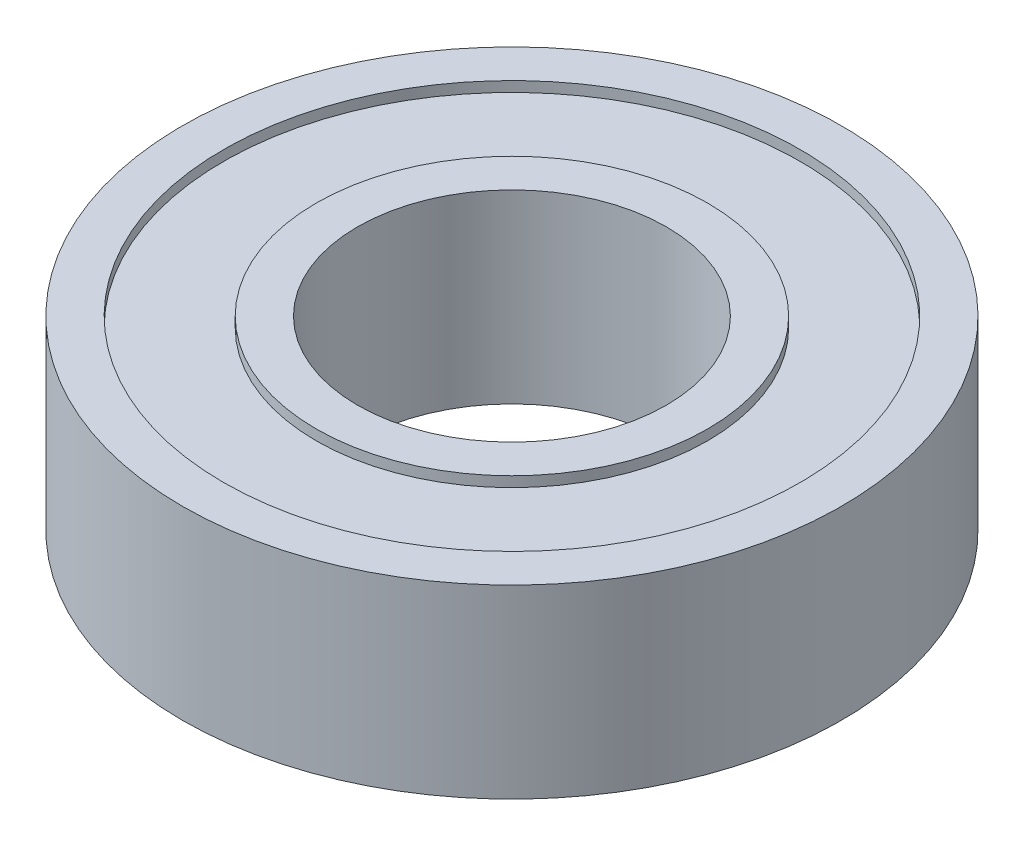
ISO-10303-21;
HEADER;
FILE_DESCRIPTION(('STEP AP214'),'2;1');
FILE_NAME('part.step','',(''),(''),'','','');
FILE_SCHEMA(('AUTOMOTIVE_DESIGN { 1 0 10303 214 1 1 1 1 }'));
ENDSEC;
DATA;
#1=APPLICATION_CONTEXT('core data for automotive mechanical design processes');
#2=APPLICATION_PROTOCOL_DEFINITION('international standard','automotive_design',2000,#1);
#3=PRODUCT_CONTEXT('',#1,'mechanical');
#4=PRODUCT('Part','Part','',(#3));
#5=PRODUCT_RELATED_PRODUCT_CATEGORY('part','',(#4));
#6=PRODUCT_DEFINITION_FORMATION('','',#4);
#7=PRODUCT_DEFINITION_CONTEXT('part definition',#1,'design');
#8=PRODUCT_DEFINITION('design','',#6,#7);
#9=PRODUCT_DEFINITION_SHAPE('','',#8);
#10=(LENGTH_UNIT() NAMED_UNIT(*) SI_UNIT(.MILLI.,.METRE.));
#11=(NAMED_UNIT(*) PLANE_ANGLE_UNIT() SI_UNIT($,.RADIAN.));
#12=(NAMED_UNIT(*) SI_UNIT($,.STERADIAN.) SOLID_ANGLE_UNIT());
#13=UNCERTAINTY_MEASURE_WITH_UNIT(LENGTH_MEASURE(1.E-05),#10,'distance_accuracy_value','');
#14=(GEOMETRIC_REPRESENTATION_CONTEXT(3) GLOBAL_UNCERTAINTY_ASSIGNED_CONTEXT((#13)) GLOBAL_UNIT_ASSIGNED_CONTEXT((#10,
#11,#12)) REPRESENTATION_CONTEXT('',''));
#15=CARTESIAN_POINT('',(0.,0.,0.));
#16=DIRECTION('',(0.,0.,1.));
#17=DIRECTION('',(1.,0.,0.));
#18=AXIS2_PLACEMENT_3D('',#15,#16,#17);
#19=CARTESIAN_POINT('',(0.,23.5028282345443,0.));
#20=DIRECTION('',(0.,1.,0.));
#21=DIRECTION('',(0.,0.,1.));
#22=AXIS2_PLACEMENT_3D('',#19,#20,#21);
#23=CYLINDRICAL_SURFACE('',#22,9.5);
#24=CARTESIAN_POINT('',(0.,4.,0.));
#25=DIRECTION('',(0.,1.,0.));
#26=DIRECTION('',(0.,0.,1.));
#27=AXIS2_PLACEMENT_3D('',#24,#25,#26);
#28=CIRCLE('',#27,9.5);
#29=CARTESIAN_POINT('',(0.,4.,9.5));
#30=VERTEX_POINT('',#29);
#31=EDGE_CURVE('E52',#30,#30,#28,.T.);
#32=ORIENTED_EDGE('',*,*,#31,.T.);
#33=EDGE_LOOP('',(#32));
#34=FACE_BOUND('',#33,.T.);
#35=CARTESIAN_POINT('',(0.,4.5,0.));
#36=DIRECTION('',(0.,1.,0.));
#37=DIRECTION('',(0.,0.,1.));
#38=AXIS2_PLACEMENT_3D('',#35,#36,#37);
#39=CIRCLE('',#38,9.5);
#40=CARTESIAN_POINT('',(0.,4.5,9.5));
#41=VERTEX_POINT('',#40);
#42=EDGE_CURVE('E39',#41,#41,#39,.T.);
#43=ORIENTED_EDGE('',*,*,#42,.F.);
#44=EDGE_LOOP('',(#43));
#45=FACE_BOUND('',#44,.T.);
#46=ADVANCED_FACE('F32',(#34,#45),#23,.T.);
#47=CARTESIAN_POINT('',(0.,23.5028282345443,0.));
#48=DIRECTION('',(0.,1.,0.));
#49=DIRECTION('',(0.,0.,1.));
#50=AXIS2_PLACEMENT_3D('',#47,#48,#49);
#51=CYLINDRICAL_SURFACE('',#50,7.5);
#52=CARTESIAN_POINT('',(0.,-4.5,0.));
#53=DIRECTION('',(0.,1.,0.));
#54=DIRECTION('',(0.,0.,1.));
#55=AXIS2_PLACEMENT_3D('',#52,#53,#54);
#56=CIRCLE('',#55,7.5);
#57=CARTESIAN_POINT('',(0.,-4.5,7.5));
#58=VERTEX_POINT('',#57);
#59=EDGE_CURVE('E47',#58,#58,#56,.T.);
#60=ORIENTED_EDGE('',*,*,#59,.F.);
#61=EDGE_LOOP('',(#60));
#62=FACE_BOUND('',#61,.T.);
#63=CARTESIAN_POINT('',(0.,4.5,0.));
#64=DIRECTION('',(0.,1.,0.));
#65=DIRECTION('',(0.,0.,1.));
#66=AXIS2_PLACEMENT_3D('',#63,#64,#65);
#67=CIRCLE('',#66,7.5);
#68=CARTESIAN_POINT('',(0.,4.5,7.5));
#69=VERTEX_POINT('',#68);
#70=EDGE_CURVE('E10',#69,#69,#67,.T.);
#71=ORIENTED_EDGE('',*,*,#70,.T.);
#72=EDGE_LOOP('',(#71));
#73=FACE_BOUND('',#72,.T.);
#74=ADVANCED_FACE('F34',(#62,#73),#51,.F.);
#75=CARTESIAN_POINT('',(7.5,4.5,0.));
#76=DIRECTION('',(0.,-1.,0.));
#77=DIRECTION('',(0.,0.,-1.));
#78=AXIS2_PLACEMENT_3D('',#75,#76,#77);
#79=PLANE('',#78);
#80=ORIENTED_EDGE('',*,*,#70,.F.);
#81=EDGE_LOOP('',(#80));
#82=FACE_BOUND('',#81,.T.);
#83=ORIENTED_EDGE('',*,*,#42,.T.);
#84=EDGE_LOOP('',(#83));
#85=FACE_BOUND('',#84,.T.);
#86=ADVANCED_FACE('F114',(#82,#85),#79,.F.);
#87=CARTESIAN_POINT('',(0.,-4.,0.));
#88=DIRECTION('',(0.,1.,0.));
#89=DIRECTION('',(0.,0.,1.));
#90=AXIS2_PLACEMENT_3D('',#87,#88,#89);
#91=CIRCLE('',#90,9.5);
#92=CARTESIAN_POINT('',(0.,-4.,9.5));
#93=VERTEX_POINT('',#92);
#94=EDGE_CURVE('E58',#93,#93,#91,.T.);
#95=ORIENTED_EDGE('',*,*,#94,.F.);
#96=EDGE_LOOP('',(#95));
#97=FACE_BOUND('',#96,.T.);
#98=CARTESIAN_POINT('',(0.,-4.5,0.));
#99=DIRECTION('',(0.,1.,0.));
#100=DIRECTION('',(0.,0.,1.));
#101=AXIS2_PLACEMENT_3D('',#98,#99,#100);
#102=CIRCLE('',#101,9.5);
#103=CARTESIAN_POINT('',(0.,-4.5,9.5));
#104=VERTEX_POINT('',#103);
#105=EDGE_CURVE('E43',#104,#104,#102,.T.);
#106=ORIENTED_EDGE('',*,*,#105,.T.);
#107=EDGE_LOOP('',(#106));
#108=FACE_BOUND('',#107,.T.);
#109=ADVANCED_FACE('F110',(#97,#108),#23,.T.);
#110=CARTESIAN_POINT('',(7.5,-4.5,0.));
#111=DIRECTION('',(0.,1.,0.));
#112=DIRECTION('',(0.,0.,1.));
#113=AXIS2_PLACEMENT_3D('',#110,#111,#112);
#114=PLANE('',#113);
#115=ORIENTED_EDGE('',*,*,#105,.F.);
#116=EDGE_LOOP('',(#115));
#117=FACE_BOUND('',#116,.T.);
#118=ORIENTED_EDGE('',*,*,#59,.T.);
#119=EDGE_LOOP('',(#118));
#120=FACE_BOUND('',#119,.T.);
#121=ADVANCED_FACE('F119',(#117,#120),#114,.F.);
#122=CARTESIAN_POINT('',(-9.5,4.,0.));
#123=DIRECTION('',(0.,1.,0.));
#124=DIRECTION('',(0.,0.,1.));
#125=AXIS2_PLACEMENT_3D('',#122,#123,#124);
#126=PLANE('',#125);
#127=CARTESIAN_POINT('',(0.,4.,0.));
#128=DIRECTION('',(0.,1.,0.));
#129=DIRECTION('',(0.,0.,1.));
#130=AXIS2_PLACEMENT_3D('',#127,#128,#129);
#131=CIRCLE('',#130,14.);
#132=CARTESIAN_POINT('',(0.,4.,14.));
#133=VERTEX_POINT('',#132);
#134=EDGE_CURVE('E61',#133,#133,#131,.T.);
#135=ORIENTED_EDGE('',*,*,#134,.T.);
#136=EDGE_LOOP('',(#135));
#137=FACE_BOUND('',#136,.T.);
#138=ORIENTED_EDGE('',*,*,#31,.F.);
#139=EDGE_LOOP('',(#138));
#140=FACE_BOUND('',#139,.T.);
#141=ADVANCED_FACE('F125',(#137,#140),#126,.T.);
#142=CARTESIAN_POINT('',(-14.,-4.,0.));
#143=DIRECTION('',(0.,-1.,0.));
#144=DIRECTION('',(0.,0.,-1.));
#145=AXIS2_PLACEMENT_3D('',#142,#143,#144);
#146=PLANE('',#145);
#147=ORIENTED_EDGE('',*,*,#94,.T.);
#148=EDGE_LOOP('',(#147));
#149=FACE_BOUND('',#148,.T.);
#150=CARTESIAN_POINT('',(0.,-4.,0.));
#151=DIRECTION('',(0.,1.,0.));
#152=DIRECTION('',(0.,0.,1.));
#153=AXIS2_PLACEMENT_3D('',#150,#151,#152);
#154=CIRCLE('',#153,14.);
#155=CARTESIAN_POINT('',(0.,-4.,14.));
#156=VERTEX_POINT('',#155);
#157=EDGE_CURVE('E55',#156,#156,#154,.T.);
#158=ORIENTED_EDGE('',*,*,#157,.F.);
#159=EDGE_LOOP('',(#158));
#160=FACE_BOUND('',#159,.T.);
#161=ADVANCED_FACE('F104',(#149,#160),#146,.T.);
#162=CARTESIAN_POINT('',(0.,23.5028282345443,0.));
#163=DIRECTION('',(0.,1.,0.));
#164=DIRECTION('',(0.,0.,1.));
#165=AXIS2_PLACEMENT_3D('',#162,#163,#164);
#166=CYLINDRICAL_SURFACE('',#165,14.);
#167=ORIENTED_EDGE('',*,*,#134,.F.);
#168=EDGE_LOOP('',(#167));
#169=FACE_BOUND('',#168,.T.);
#170=CARTESIAN_POINT('',(0.,4.5,0.));
#171=DIRECTION('',(0.,1.,0.));
#172=DIRECTION('',(0.,0.,1.));
#173=AXIS2_PLACEMENT_3D('',#170,#171,#172);
#174=CIRCLE('',#173,14.);
#175=CARTESIAN_POINT('',(0.,4.5,14.));
#176=VERTEX_POINT('',#175);
#177=EDGE_CURVE('E73',#176,#176,#174,.T.);
#178=ORIENTED_EDGE('',*,*,#177,.T.);
#179=EDGE_LOOP('',(#178));
#180=FACE_BOUND('',#179,.T.);
#181=ADVANCED_FACE('F77',(#169,#180),#166,.F.);
#182=ORIENTED_EDGE('',*,*,#157,.T.);
#183=EDGE_LOOP('',(#182));
#184=FACE_BOUND('',#183,.T.);
#185=CARTESIAN_POINT('',(0.,-4.5,0.));
#186=DIRECTION('',(0.,1.,0.));
#187=DIRECTION('',(0.,0.,1.));
#188=AXIS2_PLACEMENT_3D('',#185,#186,#187);
#189=CIRCLE('',#188,14.);
#190=CARTESIAN_POINT('',(0.,-4.5,14.));
#191=VERTEX_POINT('',#190);
#192=EDGE_CURVE('E64',#191,#191,#189,.T.);
#193=ORIENTED_EDGE('',*,*,#192,.F.);
#194=EDGE_LOOP('',(#193));
#195=FACE_BOUND('',#194,.T.);
#196=ADVANCED_FACE('F94',(#184,#195),#166,.F.);
#197=CARTESIAN_POINT('',(14.,-4.5,0.));
#198=DIRECTION('',(0.,1.,0.));
#199=DIRECTION('',(0.,0.,1.));
#200=AXIS2_PLACEMENT_3D('',#197,#198,#199);
#201=PLANE('',#200);
#202=CARTESIAN_POINT('',(0.,-4.5,0.));
#203=DIRECTION('',(0.,1.,0.));
#204=DIRECTION('',(0.,0.,1.));
#205=AXIS2_PLACEMENT_3D('',#202,#203,#204);
#206=CIRCLE('',#205,16.);
#207=CARTESIAN_POINT('',(0.,-4.5,16.));
#208=VERTEX_POINT('',#207);
#209=EDGE_CURVE('E67',#208,#208,#206,.T.);
#210=ORIENTED_EDGE('',*,*,#209,.F.);
#211=EDGE_LOOP('',(#210));
#212=FACE_BOUND('',#211,.T.);
#213=ORIENTED_EDGE('',*,*,#192,.T.);
#214=EDGE_LOOP('',(#213));
#215=FACE_BOUND('',#214,.T.);
#216=ADVANCED_FACE('F88',(#212,#215),#201,.F.);
#217=CARTESIAN_POINT('',(0.,23.5028282345443,0.));
#218=DIRECTION('',(0.,1.,0.));
#219=DIRECTION('',(0.,0.,1.));
#220=AXIS2_PLACEMENT_3D('',#217,#218,#219);
#221=CYLINDRICAL_SURFACE('',#220,16.);
#222=CARTESIAN_POINT('',(0.,4.5,0.));
#223=DIRECTION('',(0.,1.,0.));
#224=DIRECTION('',(0.,0.,1.));
#225=AXIS2_PLACEMENT_3D('',#222,#223,#224);
#226=CIRCLE('',#225,16.);
#227=CARTESIAN_POINT('',(0.,4.5,16.));
#228=VERTEX_POINT('',#227);
#229=EDGE_CURVE('E70',#228,#228,#226,.T.);
#230=ORIENTED_EDGE('',*,*,#229,.F.);
#231=EDGE_LOOP('',(#230));
#232=FACE_BOUND('',#231,.T.);
#233=ORIENTED_EDGE('',*,*,#209,.T.);
#234=EDGE_LOOP('',(#233));
#235=FACE_BOUND('',#234,.T.);
#236=ADVANCED_FACE('F82',(#232,#235),#221,.T.);
#237=CARTESIAN_POINT('',(14.,4.5,0.));
#238=DIRECTION('',(0.,-1.,0.));
#239=DIRECTION('',(0.,0.,-1.));
#240=AXIS2_PLACEMENT_3D('',#237,#238,#239);
#241=PLANE('',#240);
#242=ORIENTED_EDGE('',*,*,#177,.F.);
#243=EDGE_LOOP('',(#242));
#244=FACE_BOUND('',#243,.T.);
#245=ORIENTED_EDGE('',*,*,#229,.T.);
#246=EDGE_LOOP('',(#245));
#247=FACE_BOUND('',#246,.T.);
#248=ADVANCED_FACE('F79',(#244,#247),#241,.F.);
#249=CLOSED_SHELL('',(#46,#74,#86,#109,#121,#141,#161,#181,#196,#216,#236,#248));
#250=MANIFOLD_SOLID_BREP('B2',#249);
#251=ADVANCED_BREP_SHAPE_REPRESENTATION('',(#18,#250),#14);
#252=SHAPE_DEFINITION_REPRESENTATION(#9,#251);
ENDSEC;
END-ISO-10303-21;
